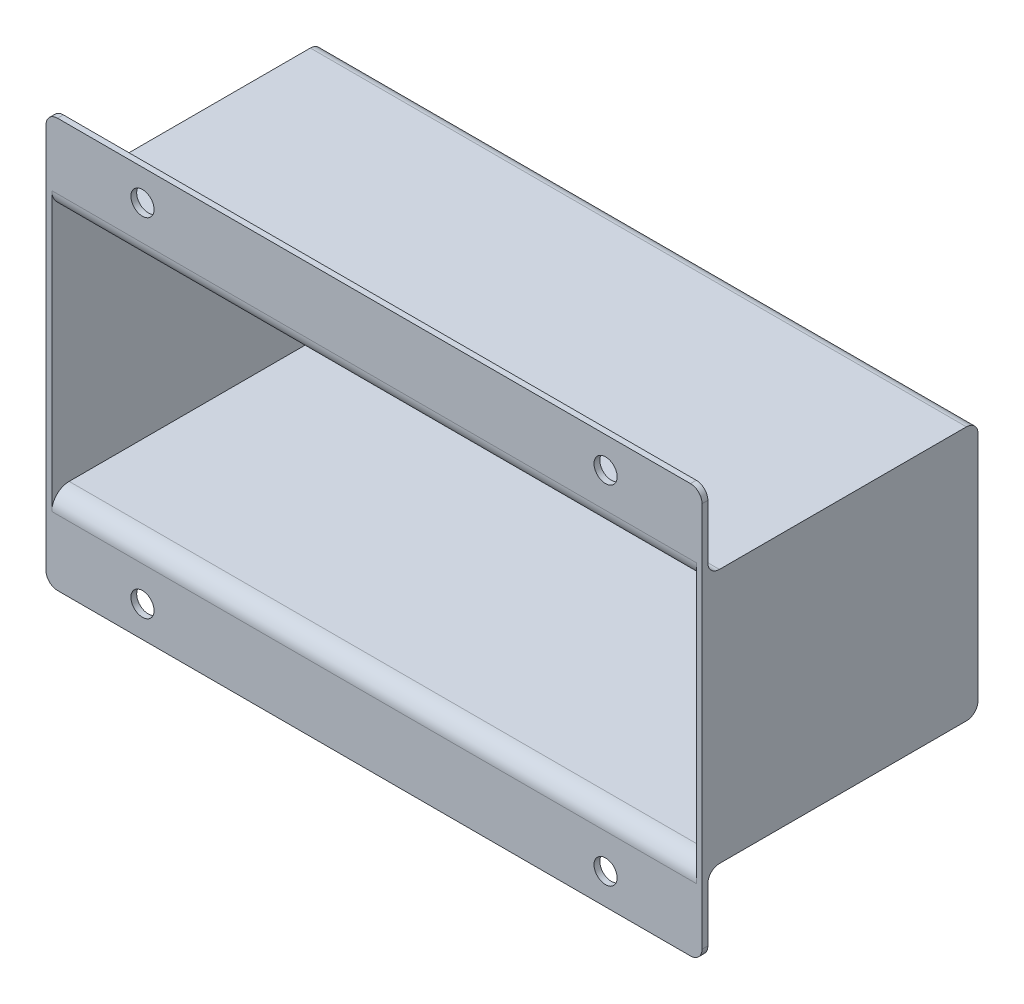
ISO-10303-21;
HEADER;
FILE_DESCRIPTION(('STEP AP214'),'2;1');
FILE_NAME('part.step','',(''),(''),'','','');
FILE_SCHEMA(('AUTOMOTIVE_DESIGN { 1 0 10303 214 1 1 1 1 }'));
ENDSEC;
DATA;
#1=APPLICATION_CONTEXT('core data for automotive mechanical design processes');
#2=APPLICATION_PROTOCOL_DEFINITION('international standard','automotive_design',2000,#1);
#3=PRODUCT_CONTEXT('',#1,'mechanical');
#4=PRODUCT('Part','Part','',(#3));
#5=PRODUCT_RELATED_PRODUCT_CATEGORY('part','',(#4));
#6=PRODUCT_DEFINITION_FORMATION('','',#4);
#7=PRODUCT_DEFINITION_CONTEXT('part definition',#1,'design');
#8=PRODUCT_DEFINITION('design','',#6,#7);
#9=PRODUCT_DEFINITION_SHAPE('','',#8);
#10=(LENGTH_UNIT() NAMED_UNIT(*) SI_UNIT(.MILLI.,.METRE.));
#11=(NAMED_UNIT(*) PLANE_ANGLE_UNIT() SI_UNIT($,.RADIAN.));
#12=(NAMED_UNIT(*) SI_UNIT($,.STERADIAN.) SOLID_ANGLE_UNIT());
#13=UNCERTAINTY_MEASURE_WITH_UNIT(LENGTH_MEASURE(1.E-05),#10,'distance_accuracy_value','');
#14=(GEOMETRIC_REPRESENTATION_CONTEXT(3) GLOBAL_UNCERTAINTY_ASSIGNED_CONTEXT((#13)) GLOBAL_UNIT_ASSIGNED_CONTEXT((#10,
#11,#12)) REPRESENTATION_CONTEXT('',''));
#15=CARTESIAN_POINT('',(0.,0.,0.));
#16=DIRECTION('',(0.,0.,1.));
#17=DIRECTION('',(1.,0.,0.));
#18=AXIS2_PLACEMENT_3D('',#15,#16,#17);
#19=CARTESIAN_POINT('',(0.,0.,70.));
#20=DIRECTION('',(1.,0.,0.));
#21=DIRECTION('',(0.,0.,-1.));
#22=AXIS2_PLACEMENT_3D('',#19,#20,#21);
#23=PLANE('',#22);
#24=DIRECTION('',(0.,-1.,0.));
#25=VECTOR('',#24,1.);
#26=CARTESIAN_POINT('',(0.,-20.,71.5));
#27=LINE('',#26,#25);
#28=CARTESIAN_POINT('',(0.,83.,71.5));
#29=VERTEX_POINT('',#28);
#30=CARTESIAN_POINT('',(0.,-17.,71.5));
#31=VERTEX_POINT('',#30);
#32=EDGE_CURVE('E342',#29,#31,#27,.T.);
#33=ORIENTED_EDGE('',*,*,#32,.F.);
#34=DIRECTION('',(0.,0.,-1.));
#35=VECTOR('',#34,1.);
#36=CARTESIAN_POINT('',(0.,83.,70.));
#37=LINE('',#36,#35);
#38=CARTESIAN_POINT('',(0.,83.,70.));
#39=VERTEX_POINT('',#38);
#40=EDGE_CURVE('E398',#29,#39,#37,.T.);
#41=ORIENTED_EDGE('',*,*,#40,.T.);
#42=DIRECTION('',(0.,-1.,0.));
#43=VECTOR('',#42,1.);
#44=CARTESIAN_POINT('',(0.,86.,70.));
#45=LINE('',#44,#43);
#46=CARTESIAN_POINT('',(0.,69.,70.));
#47=VERTEX_POINT('',#46);
#48=EDGE_CURVE('E250',#39,#47,#45,.T.);
#49=ORIENTED_EDGE('',*,*,#48,.T.);
#50=CARTESIAN_POINT('',(0.,69.,67.));
#51=DIRECTION('',(1.,0.,0.));
#52=DIRECTION('',(0.,0.,-1.));
#53=AXIS2_PLACEMENT_3D('',#50,#51,#52);
#54=CIRCLE('',#53,3.);
#55=CARTESIAN_POINT('',(0.,66.,67.));
#56=VERTEX_POINT('',#55);
#57=EDGE_CURVE('E328',#47,#56,#54,.T.);
#58=ORIENTED_EDGE('',*,*,#57,.T.);
#59=DIRECTION('',(0.,0.,-1.));
#60=VECTOR('',#59,1.);
#61=CARTESIAN_POINT('',(0.,66.,70.));
#62=LINE('',#61,#60);
#63=CARTESIAN_POINT('',(0.,66.,3.));
#64=VERTEX_POINT('',#63);
#65=EDGE_CURVE('E286',#56,#64,#62,.T.);
#66=ORIENTED_EDGE('',*,*,#65,.T.);
#67=CARTESIAN_POINT('',(0.,63.,3.));
#68=DIRECTION('',(1.,0.,0.));
#69=DIRECTION('',(0.,0.,-1.));
#70=AXIS2_PLACEMENT_3D('',#67,#68,#69);
#71=CIRCLE('',#70,3.);
#72=CARTESIAN_POINT('',(0.,63.,0.));
#73=VERTEX_POINT('',#72);
#74=EDGE_CURVE('E285',#64,#73,#71,.F.);
#75=ORIENTED_EDGE('',*,*,#74,.T.);
#76=DIRECTION('',(0.,-1.,0.));
#77=VECTOR('',#76,1.);
#78=CARTESIAN_POINT('',(0.,0.,0.));
#79=LINE('',#78,#77);
#80=CARTESIAN_POINT('',(0.,3.,0.));
#81=VERTEX_POINT('',#80);
#82=EDGE_CURVE('E365',#73,#81,#79,.T.);
#83=ORIENTED_EDGE('',*,*,#82,.T.);
#84=CARTESIAN_POINT('',(0.,3.,3.));
#85=DIRECTION('',(1.,0.,0.));
#86=DIRECTION('',(0.,0.,-1.));
#87=AXIS2_PLACEMENT_3D('',#84,#85,#86);
#88=CIRCLE('',#87,3.);
#89=CARTESIAN_POINT('',(0.,0.,3.));
#90=VERTEX_POINT('',#89);
#91=EDGE_CURVE('E324',#81,#90,#88,.F.);
#92=ORIENTED_EDGE('',*,*,#91,.T.);
#93=DIRECTION('',(0.,0.,-1.));
#94=VECTOR('',#93,1.);
#95=CARTESIAN_POINT('',(0.,0.,70.));
#96=LINE('',#95,#94);
#97=CARTESIAN_POINT('',(0.,0.,67.));
#98=VERTEX_POINT('',#97);
#99=EDGE_CURVE('E302',#98,#90,#96,.T.);
#100=ORIENTED_EDGE('',*,*,#99,.F.);
#101=CARTESIAN_POINT('',(0.,-3.,67.));
#102=DIRECTION('',(1.,0.,0.));
#103=DIRECTION('',(0.,0.,-1.));
#104=AXIS2_PLACEMENT_3D('',#101,#102,#103);
#105=CIRCLE('',#104,3.);
#106=CARTESIAN_POINT('',(0.,-3.,70.));
#107=VERTEX_POINT('',#106);
#108=EDGE_CURVE('E320',#98,#107,#105,.T.);
#109=ORIENTED_EDGE('',*,*,#108,.T.);
#110=CARTESIAN_POINT('',(0.,-17.,70.));
#111=VERTEX_POINT('',#110);
#112=EDGE_CURVE('E214',#107,#111,#45,.T.);
#113=ORIENTED_EDGE('',*,*,#112,.T.);
#114=DIRECTION('',(0.,0.,-1.));
#115=VECTOR('',#114,1.);
#116=CARTESIAN_POINT('',(0.,-17.,70.));
#117=LINE('',#116,#115);
#118=EDGE_CURVE('E393',#111,#31,#117,.F.);
#119=ORIENTED_EDGE('',*,*,#118,.T.);
#120=EDGE_LOOP('',(#33,#41,#49,#58,#66,#75,#83,#92,#100,#109,#113,#119));
#121=FACE_BOUND('',#120,.T.);
#122=ADVANCED_FACE('F33',(#121),#23,.F.);
#123=CARTESIAN_POINT('',(170.,0.,70.));
#124=DIRECTION('',(-1.,0.,0.));
#125=DIRECTION('',(0.,0.,1.));
#126=AXIS2_PLACEMENT_3D('',#123,#124,#125);
#127=PLANE('',#126);
#128=DIRECTION('',(0.,1.,0.));
#129=VECTOR('',#128,1.);
#130=CARTESIAN_POINT('',(170.,86.,70.));
#131=LINE('',#130,#129);
#132=CARTESIAN_POINT('',(170.,69.,70.));
#133=VERTEX_POINT('',#132);
#134=CARTESIAN_POINT('',(170.,83.,70.));
#135=VERTEX_POINT('',#134);
#136=EDGE_CURVE('E263',#133,#135,#131,.T.);
#137=ORIENTED_EDGE('',*,*,#136,.T.);
#138=DIRECTION('',(0.,0.,-1.));
#139=VECTOR('',#138,1.);
#140=CARTESIAN_POINT('',(170.,83.,70.));
#141=LINE('',#140,#139);
#142=CARTESIAN_POINT('',(170.,83.,71.5));
#143=VERTEX_POINT('',#142);
#144=EDGE_CURVE('E420',#135,#143,#141,.F.);
#145=ORIENTED_EDGE('',*,*,#144,.T.);
#146=DIRECTION('',(0.,1.,0.));
#147=VECTOR('',#146,1.);
#148=CARTESIAN_POINT('',(170.,0.,71.5));
#149=LINE('',#148,#147);
#150=CARTESIAN_POINT('',(170.,-17.,71.5));
#151=VERTEX_POINT('',#150);
#152=EDGE_CURVE('E204',#151,#143,#149,.T.);
#153=ORIENTED_EDGE('',*,*,#152,.F.);
#154=DIRECTION('',(0.,0.,-1.));
#155=VECTOR('',#154,1.);
#156=CARTESIAN_POINT('',(170.,-17.,70.));
#157=LINE('',#156,#155);
#158=CARTESIAN_POINT('',(170.,-17.,70.));
#159=VERTEX_POINT('',#158);
#160=EDGE_CURVE('E259',#151,#159,#157,.T.);
#161=ORIENTED_EDGE('',*,*,#160,.T.);
#162=CARTESIAN_POINT('',(170.,-3.,70.));
#163=VERTEX_POINT('',#162);
#164=EDGE_CURVE('E260',#159,#163,#131,.T.);
#165=ORIENTED_EDGE('',*,*,#164,.T.);
#166=CARTESIAN_POINT('',(170.,-3.,67.));
#167=DIRECTION('',(-1.,0.,0.));
#168=DIRECTION('',(0.,0.,1.));
#169=AXIS2_PLACEMENT_3D('',#166,#167,#168);
#170=CIRCLE('',#169,3.);
#171=CARTESIAN_POINT('',(170.,0.,67.));
#172=VERTEX_POINT('',#171);
#173=EDGE_CURVE('E329',#163,#172,#170,.T.);
#174=ORIENTED_EDGE('',*,*,#173,.T.);
#175=DIRECTION('',(0.,0.,-1.));
#176=VECTOR('',#175,1.);
#177=CARTESIAN_POINT('',(170.,0.,70.));
#178=LINE('',#177,#176);
#179=CARTESIAN_POINT('',(170.,0.,3.));
#180=VERTEX_POINT('',#179);
#181=EDGE_CURVE('E299',#172,#180,#178,.T.);
#182=ORIENTED_EDGE('',*,*,#181,.T.);
#183=CARTESIAN_POINT('',(170.,3.,3.));
#184=DIRECTION('',(-1.,0.,0.));
#185=DIRECTION('',(0.,0.,1.));
#186=AXIS2_PLACEMENT_3D('',#183,#184,#185);
#187=CIRCLE('',#186,3.);
#188=CARTESIAN_POINT('',(170.,3.,0.));
#189=VERTEX_POINT('',#188);
#190=EDGE_CURVE('E278',#180,#189,#187,.F.);
#191=ORIENTED_EDGE('',*,*,#190,.T.);
#192=DIRECTION('',(0.,1.,0.));
#193=VECTOR('',#192,1.);
#194=CARTESIAN_POINT('',(170.,0.,0.));
#195=LINE('',#194,#193);
#196=CARTESIAN_POINT('',(170.,63.,0.));
#197=VERTEX_POINT('',#196);
#198=EDGE_CURVE('E290',#189,#197,#195,.T.);
#199=ORIENTED_EDGE('',*,*,#198,.T.);
#200=CARTESIAN_POINT('',(170.,63.,3.));
#201=DIRECTION('',(-1.,0.,0.));
#202=DIRECTION('',(0.,0.,1.));
#203=AXIS2_PLACEMENT_3D('',#200,#201,#202);
#204=CIRCLE('',#203,3.);
#205=CARTESIAN_POINT('',(170.,66.,3.));
#206=VERTEX_POINT('',#205);
#207=EDGE_CURVE('E276',#197,#206,#204,.F.);
#208=ORIENTED_EDGE('',*,*,#207,.T.);
#209=DIRECTION('',(0.,0.,-1.));
#210=VECTOR('',#209,1.);
#211=CARTESIAN_POINT('',(170.,66.,70.));
#212=LINE('',#211,#210);
#213=CARTESIAN_POINT('',(170.,66.,67.));
#214=VERTEX_POINT('',#213);
#215=EDGE_CURVE('E273',#214,#206,#212,.T.);
#216=ORIENTED_EDGE('',*,*,#215,.F.);
#217=CARTESIAN_POINT('',(170.,69.,67.));
#218=DIRECTION('',(-1.,0.,0.));
#219=DIRECTION('',(0.,0.,1.));
#220=AXIS2_PLACEMENT_3D('',#217,#218,#219);
#221=CIRCLE('',#220,3.);
#222=EDGE_CURVE('E331',#214,#133,#221,.T.);
#223=ORIENTED_EDGE('',*,*,#222,.T.);
#224=EDGE_LOOP('',(#137,#145,#153,#161,#165,#174,#182,#191,#199,#208,#216,#223));
#225=FACE_BOUND('',#224,.T.);
#226=ADVANCED_FACE('F371',(#225),#127,.F.);
#227=CARTESIAN_POINT('',(0.,-20.,75.));
#228=DIRECTION('',(0.,1.,0.));
#229=DIRECTION('',(0.,0.,1.));
#230=AXIS2_PLACEMENT_3D('',#227,#228,#229);
#231=PLANE('',#230);
#232=DIRECTION('',(1.,0.,0.));
#233=VECTOR('',#232,1.);
#234=CARTESIAN_POINT('',(0.,-20.,71.5));
#235=LINE('',#234,#233);
#236=CARTESIAN_POINT('',(3.,-20.,71.5));
#237=VERTEX_POINT('',#236);
#238=CARTESIAN_POINT('',(167.,-20.,71.5));
#239=VERTEX_POINT('',#238);
#240=EDGE_CURVE('E234',#237,#239,#235,.T.);
#241=ORIENTED_EDGE('',*,*,#240,.F.);
#242=DIRECTION('',(0.,0.,-1.));
#243=VECTOR('',#242,1.);
#244=CARTESIAN_POINT('',(3.,-20.,75.));
#245=LINE('',#244,#243);
#246=CARTESIAN_POINT('',(3.,-20.,70.));
#247=VERTEX_POINT('',#246);
#248=EDGE_CURVE('E409',#237,#247,#245,.T.);
#249=ORIENTED_EDGE('',*,*,#248,.T.);
#250=DIRECTION('',(1.,0.,0.));
#251=VECTOR('',#250,1.);
#252=CARTESIAN_POINT('',(0.,-20.,70.));
#253=LINE('',#252,#251);
#254=CARTESIAN_POINT('',(167.,-20.,70.));
#255=VERTEX_POINT('',#254);
#256=EDGE_CURVE('E243',#247,#255,#253,.T.);
#257=ORIENTED_EDGE('',*,*,#256,.T.);
#258=DIRECTION('',(0.,0.,-1.));
#259=VECTOR('',#258,1.);
#260=CARTESIAN_POINT('',(167.,-20.,75.));
#261=LINE('',#260,#259);
#262=EDGE_CURVE('E402',#255,#239,#261,.F.);
#263=ORIENTED_EDGE('',*,*,#262,.T.);
#264=EDGE_LOOP('',(#241,#249,#257,#263));
#265=FACE_BOUND('',#264,.T.);
#266=ADVANCED_FACE('F412',(#265),#231,.F.);
#267=CARTESIAN_POINT('',(0.,86.,75.));
#268=DIRECTION('',(0.,-1.,0.));
#269=DIRECTION('',(0.,0.,-1.));
#270=AXIS2_PLACEMENT_3D('',#267,#268,#269);
#271=PLANE('',#270);
#272=DIRECTION('',(-1.,0.,0.));
#273=VECTOR('',#272,1.);
#274=CARTESIAN_POINT('',(0.,86.,71.5));
#275=LINE('',#274,#273);
#276=CARTESIAN_POINT('',(167.,86.,71.5));
#277=VERTEX_POINT('',#276);
#278=CARTESIAN_POINT('',(3.,86.,71.5));
#279=VERTEX_POINT('',#278);
#280=EDGE_CURVE('E237',#277,#279,#275,.T.);
#281=ORIENTED_EDGE('',*,*,#280,.F.);
#282=DIRECTION('',(0.,0.,-1.));
#283=VECTOR('',#282,1.);
#284=CARTESIAN_POINT('',(167.,86.,75.));
#285=LINE('',#284,#283);
#286=CARTESIAN_POINT('',(167.,86.,70.));
#287=VERTEX_POINT('',#286);
#288=EDGE_CURVE('E253',#277,#287,#285,.T.);
#289=ORIENTED_EDGE('',*,*,#288,.T.);
#290=DIRECTION('',(-1.,0.,0.));
#291=VECTOR('',#290,1.);
#292=CARTESIAN_POINT('',(0.,86.,70.));
#293=LINE('',#292,#291);
#294=CARTESIAN_POINT('',(3.,86.,70.));
#295=VERTEX_POINT('',#294);
#296=EDGE_CURVE('E262',#287,#295,#293,.T.);
#297=ORIENTED_EDGE('',*,*,#296,.T.);
#298=DIRECTION('',(0.,0.,-1.));
#299=VECTOR('',#298,1.);
#300=CARTESIAN_POINT('',(3.,86.,75.));
#301=LINE('',#300,#299);
#302=EDGE_CURVE('E338',#295,#279,#301,.F.);
#303=ORIENTED_EDGE('',*,*,#302,.T.);
#304=EDGE_LOOP('',(#281,#289,#297,#303));
#305=FACE_BOUND('',#304,.T.);
#306=ADVANCED_FACE('F358',(#305),#271,.F.);
#307=CARTESIAN_POINT('',(1.5,0.,70.));
#308=DIRECTION('',(1.,0.,0.));
#309=DIRECTION('',(0.,0.,-1.));
#310=AXIS2_PLACEMENT_3D('',#307,#308,#309);
#311=PLANE('',#310);
#312=CARTESIAN_POINT('',(1.5,69.,67.));
#313=DIRECTION('',(1.,0.,0.));
#314=DIRECTION('',(0.,0.,-1.));
#315=AXIS2_PLACEMENT_3D('',#312,#313,#314);
#316=CIRCLE('',#315,4.5);
#317=CARTESIAN_POINT('',(1.5,69.,71.5));
#318=VERTEX_POINT('',#317);
#319=CARTESIAN_POINT('',(1.5,64.5,67.));
#320=VERTEX_POINT('',#319);
#321=EDGE_CURVE('E215',#318,#320,#316,.T.);
#322=ORIENTED_EDGE('',*,*,#321,.F.);
#323=DIRECTION('',(0.,-1.,0.));
#324=VECTOR('',#323,1.);
#325=CARTESIAN_POINT('',(1.5,0.,71.5));
#326=LINE('',#325,#324);
#327=CARTESIAN_POINT('',(1.5,-3.,71.5));
#328=VERTEX_POINT('',#327);
#329=EDGE_CURVE('E205',#318,#328,#326,.T.);
#330=ORIENTED_EDGE('',*,*,#329,.T.);
#331=CARTESIAN_POINT('',(1.5,-3.,67.));
#332=DIRECTION('',(1.,0.,0.));
#333=DIRECTION('',(0.,0.,-1.));
#334=AXIS2_PLACEMENT_3D('',#331,#332,#333);
#335=CIRCLE('',#334,4.5);
#336=CARTESIAN_POINT('',(1.5,1.5,67.));
#337=VERTEX_POINT('',#336);
#338=EDGE_CURVE('E222',#337,#328,#335,.T.);
#339=ORIENTED_EDGE('',*,*,#338,.F.);
#340=DIRECTION('',(0.,0.,-1.));
#341=VECTOR('',#340,1.);
#342=CARTESIAN_POINT('',(1.5,1.5,70.));
#343=LINE('',#342,#341);
#344=CARTESIAN_POINT('',(1.5,1.5,3.));
#345=VERTEX_POINT('',#344);
#346=EDGE_CURVE('E233',#337,#345,#343,.T.);
#347=ORIENTED_EDGE('',*,*,#346,.T.);
#348=CARTESIAN_POINT('',(1.5,3.,3.));
#349=DIRECTION('',(1.,0.,0.));
#350=DIRECTION('',(0.,0.,-1.));
#351=AXIS2_PLACEMENT_3D('',#348,#349,#350);
#352=CIRCLE('',#351,1.5);
#353=CARTESIAN_POINT('',(1.5,3.,1.5));
#354=VERTEX_POINT('',#353);
#355=EDGE_CURVE('E581',#354,#345,#352,.F.);
#356=ORIENTED_EDGE('',*,*,#355,.F.);
#357=DIRECTION('',(0.,-1.,0.));
#358=VECTOR('',#357,1.);
#359=CARTESIAN_POINT('',(1.5,66.,1.5));
#360=LINE('',#359,#358);
#361=CARTESIAN_POINT('',(1.5,63.,1.5));
#362=VERTEX_POINT('',#361);
#363=EDGE_CURVE('E240',#362,#354,#360,.T.);
#364=ORIENTED_EDGE('',*,*,#363,.F.);
#365=CARTESIAN_POINT('',(1.5,63.,3.));
#366=DIRECTION('',(1.,0.,0.));
#367=DIRECTION('',(0.,0.,-1.));
#368=AXIS2_PLACEMENT_3D('',#365,#366,#367);
#369=CIRCLE('',#368,1.5);
#370=CARTESIAN_POINT('',(1.5,64.5,3.));
#371=VERTEX_POINT('',#370);
#372=EDGE_CURVE('E583',#371,#362,#369,.F.);
#373=ORIENTED_EDGE('',*,*,#372,.F.);
#374=DIRECTION('',(0.,0.,-1.));
#375=VECTOR('',#374,1.);
#376=CARTESIAN_POINT('',(1.5,64.5,70.));
#377=LINE('',#376,#375);
#378=EDGE_CURVE('E590',#320,#371,#377,.T.);
#379=ORIENTED_EDGE('',*,*,#378,.F.);
#380=EDGE_LOOP('',(#322,#330,#339,#347,#356,#364,#373,#379));
#381=FACE_BOUND('',#380,.T.);
#382=ADVANCED_FACE('F480',(#381),#311,.T.);
#383=CARTESIAN_POINT('',(168.5,0.,70.));
#384=DIRECTION('',(-1.,0.,0.));
#385=DIRECTION('',(0.,0.,1.));
#386=AXIS2_PLACEMENT_3D('',#383,#384,#385);
#387=PLANE('',#386);
#388=CARTESIAN_POINT('',(168.5,-3.,67.));
#389=DIRECTION('',(-1.,0.,0.));
#390=DIRECTION('',(0.,0.,1.));
#391=AXIS2_PLACEMENT_3D('',#388,#389,#390);
#392=CIRCLE('',#391,4.5);
#393=CARTESIAN_POINT('',(168.5,-3.,71.5));
#394=VERTEX_POINT('',#393);
#395=CARTESIAN_POINT('',(168.5,1.5,67.));
#396=VERTEX_POINT('',#395);
#397=EDGE_CURVE('E199',#394,#396,#392,.T.);
#398=ORIENTED_EDGE('',*,*,#397,.F.);
#399=DIRECTION('',(0.,1.,0.));
#400=VECTOR('',#399,1.);
#401=CARTESIAN_POINT('',(168.5,0.,71.5));
#402=LINE('',#401,#400);
#403=CARTESIAN_POINT('',(168.5,69.,71.5));
#404=VERTEX_POINT('',#403);
#405=EDGE_CURVE('E193',#394,#404,#402,.T.);
#406=ORIENTED_EDGE('',*,*,#405,.T.);
#407=CARTESIAN_POINT('',(168.5,69.,67.));
#408=DIRECTION('',(-1.,0.,0.));
#409=DIRECTION('',(0.,0.,1.));
#410=AXIS2_PLACEMENT_3D('',#407,#408,#409);
#411=CIRCLE('',#410,4.5);
#412=CARTESIAN_POINT('',(168.5,64.5,67.));
#413=VERTEX_POINT('',#412);
#414=EDGE_CURVE('E197',#413,#404,#411,.T.);
#415=ORIENTED_EDGE('',*,*,#414,.F.);
#416=DIRECTION('',(0.,0.,-1.));
#417=VECTOR('',#416,1.);
#418=CARTESIAN_POINT('',(168.5,64.5,70.));
#419=LINE('',#418,#417);
#420=CARTESIAN_POINT('',(168.5,64.5,3.));
#421=VERTEX_POINT('',#420);
#422=EDGE_CURVE('E593',#413,#421,#419,.T.);
#423=ORIENTED_EDGE('',*,*,#422,.T.);
#424=CARTESIAN_POINT('',(168.5,63.,3.));
#425=DIRECTION('',(-1.,0.,0.));
#426=DIRECTION('',(0.,0.,1.));
#427=AXIS2_PLACEMENT_3D('',#424,#425,#426);
#428=CIRCLE('',#427,1.5);
#429=CARTESIAN_POINT('',(168.5,63.,1.5));
#430=VERTEX_POINT('',#429);
#431=EDGE_CURVE('E599',#430,#421,#428,.F.);
#432=ORIENTED_EDGE('',*,*,#431,.F.);
#433=DIRECTION('',(0.,1.,0.));
#434=VECTOR('',#433,1.);
#435=CARTESIAN_POINT('',(168.5,66.,1.5));
#436=LINE('',#435,#434);
#437=CARTESIAN_POINT('',(168.5,3.,1.5));
#438=VERTEX_POINT('',#437);
#439=EDGE_CURVE('E580',#438,#430,#436,.T.);
#440=ORIENTED_EDGE('',*,*,#439,.F.);
#441=CARTESIAN_POINT('',(168.5,3.,3.));
#442=DIRECTION('',(-1.,0.,0.));
#443=DIRECTION('',(0.,0.,1.));
#444=AXIS2_PLACEMENT_3D('',#441,#442,#443);
#445=CIRCLE('',#444,1.5);
#446=CARTESIAN_POINT('',(168.5,1.5,3.));
#447=VERTEX_POINT('',#446);
#448=EDGE_CURVE('E602',#447,#438,#445,.F.);
#449=ORIENTED_EDGE('',*,*,#448,.F.);
#450=DIRECTION('',(0.,0.,-1.));
#451=VECTOR('',#450,1.);
#452=CARTESIAN_POINT('',(168.5,1.5,70.));
#453=LINE('',#452,#451);
#454=EDGE_CURVE('E586',#396,#447,#453,.T.);
#455=ORIENTED_EDGE('',*,*,#454,.F.);
#456=EDGE_LOOP('',(#398,#406,#415,#423,#432,#440,#449,#455));
#457=FACE_BOUND('',#456,.T.);
#458=ADVANCED_FACE('F195',(#457),#387,.T.);
#459=CARTESIAN_POINT('',(0.,0.,70.));
#460=DIRECTION('',(0.,1.,0.));
#461=DIRECTION('',(0.,0.,1.));
#462=AXIS2_PLACEMENT_3D('',#459,#460,#461);
#463=PLANE('',#462);
#464=ORIENTED_EDGE('',*,*,#181,.F.);
#465=DIRECTION('',(1.,0.,0.));
#466=VECTOR('',#465,1.);
#467=CARTESIAN_POINT('',(0.,0.,67.));
#468=LINE('',#467,#466);
#469=EDGE_CURVE('E279',#172,#98,#468,.F.);
#470=ORIENTED_EDGE('',*,*,#469,.T.);
#471=ORIENTED_EDGE('',*,*,#99,.T.);
#472=DIRECTION('',(1.,0.,0.));
#473=VECTOR('',#472,1.);
#474=CARTESIAN_POINT('',(170.,0.,3.));
#475=LINE('',#474,#473);
#476=EDGE_CURVE('E306',#90,#180,#475,.T.);
#477=ORIENTED_EDGE('',*,*,#476,.T.);
#478=EDGE_LOOP('',(#464,#470,#471,#477));
#479=FACE_BOUND('',#478,.T.);
#480=ADVANCED_FACE('F312',(#479),#463,.F.);
#481=CARTESIAN_POINT('',(0.,66.,70.));
#482=DIRECTION('',(0.,-1.,0.));
#483=DIRECTION('',(0.,0.,-1.));
#484=AXIS2_PLACEMENT_3D('',#481,#482,#483);
#485=PLANE('',#484);
#486=ORIENTED_EDGE('',*,*,#215,.T.);
#487=DIRECTION('',(-1.,0.,0.));
#488=VECTOR('',#487,1.);
#489=CARTESIAN_POINT('',(0.,66.,3.));
#490=LINE('',#489,#488);
#491=EDGE_CURVE('E381',#206,#64,#490,.T.);
#492=ORIENTED_EDGE('',*,*,#491,.T.);
#493=ORIENTED_EDGE('',*,*,#65,.F.);
#494=DIRECTION('',(-1.,0.,0.));
#495=VECTOR('',#494,1.);
#496=CARTESIAN_POINT('',(170.,66.,67.));
#497=LINE('',#496,#495);
#498=EDGE_CURVE('E384',#56,#214,#497,.F.);
#499=ORIENTED_EDGE('',*,*,#498,.T.);
#500=EDGE_LOOP('',(#486,#492,#493,#499));
#501=FACE_BOUND('',#500,.T.);
#502=ADVANCED_FACE('F466',(#501),#485,.F.);
#503=CARTESIAN_POINT('',(0.,66.,0.));
#504=DIRECTION('',(0.,0.,-1.));
#505=DIRECTION('',(-1.,0.,0.));
#506=AXIS2_PLACEMENT_3D('',#503,#504,#505);
#507=PLANE('',#506);
#508=CARTESIAN_POINT('',(35.,33.,0.));
#509=DIRECTION('',(0.,0.,-1.));
#510=DIRECTION('',(1.,0.,0.));
#511=AXIS2_PLACEMENT_3D('',#508,#509,#510);
#512=CIRCLE('',#511,11.);
#513=CARTESIAN_POINT('',(46.,33.,0.));
#514=VERTEX_POINT('',#513);
#515=EDGE_CURVE('E350',#514,#514,#512,.T.);
#516=ORIENTED_EDGE('',*,*,#515,.F.);
#517=EDGE_LOOP('',(#516));
#518=FACE_BOUND('',#517,.T.);
#519=CARTESIAN_POINT('',(85.,33.,0.));
#520=DIRECTION('',(0.,0.,-1.));
#521=DIRECTION('',(-1.,0.,0.));
#522=AXIS2_PLACEMENT_3D('',#519,#520,#521);
#523=CIRCLE('',#522,11.);
#524=CARTESIAN_POINT('',(74.,33.,0.));
#525=VERTEX_POINT('',#524);
#526=EDGE_CURVE('E347',#525,#525,#523,.T.);
#527=ORIENTED_EDGE('',*,*,#526,.F.);
#528=EDGE_LOOP('',(#527));
#529=FACE_BOUND('',#528,.T.);
#530=CARTESIAN_POINT('',(135.,33.,0.));
#531=DIRECTION('',(0.,0.,-1.));
#532=DIRECTION('',(-1.,0.,0.));
#533=AXIS2_PLACEMENT_3D('',#530,#531,#532);
#534=CIRCLE('',#533,11.);
#535=CARTESIAN_POINT('',(124.,33.,0.));
#536=VERTEX_POINT('',#535);
#537=EDGE_CURVE('E343',#536,#536,#534,.T.);
#538=ORIENTED_EDGE('',*,*,#537,.F.);
#539=EDGE_LOOP('',(#538));
#540=FACE_BOUND('',#539,.T.);
#541=ORIENTED_EDGE('',*,*,#198,.F.);
#542=DIRECTION('',(1.,0.,0.));
#543=VECTOR('',#542,1.);
#544=CARTESIAN_POINT('',(0.,3.,0.));
#545=LINE('',#544,#543);
#546=EDGE_CURVE('E283',#189,#81,#545,.F.);
#547=ORIENTED_EDGE('',*,*,#546,.T.);
#548=ORIENTED_EDGE('',*,*,#82,.F.);
#549=DIRECTION('',(-1.,0.,0.));
#550=VECTOR('',#549,1.);
#551=CARTESIAN_POINT('',(170.,63.,0.));
#552=LINE('',#551,#550);
#553=EDGE_CURVE('E281',#73,#197,#552,.F.);
#554=ORIENTED_EDGE('',*,*,#553,.T.);
#555=EDGE_LOOP('',(#541,#547,#548,#554));
#556=FACE_BOUND('',#555,.T.);
#557=ADVANCED_FACE('F388',(#518,#529,#540,#556),#507,.T.);
#558=CARTESIAN_POINT('',(0.,-20.,70.));
#559=DIRECTION('',(0.,0.,1.));
#560=DIRECTION('',(1.,0.,0.));
#561=AXIS2_PLACEMENT_3D('',#558,#559,#560);
#562=PLANE('',#561);
#563=CARTESIAN_POINT('',(25.,-12.,70.));
#564=DIRECTION('',(0.,0.,1.));
#565=DIRECTION('',(1.,0.,0.));
#566=AXIS2_PLACEMENT_3D('',#563,#564,#565);
#567=CIRCLE('',#566,3.);
#568=CARTESIAN_POINT('',(28.,-12.,70.));
#569=VERTEX_POINT('',#568);
#570=EDGE_CURVE('E561',#569,#569,#567,.T.);
#571=ORIENTED_EDGE('',*,*,#570,.T.);
#572=EDGE_LOOP('',(#571));
#573=FACE_BOUND('',#572,.T.);
#574=CARTESIAN_POINT('',(145.,-12.,70.));
#575=DIRECTION('',(0.,0.,1.));
#576=DIRECTION('',(1.,0.,0.));
#577=AXIS2_PLACEMENT_3D('',#574,#575,#576);
#578=CIRCLE('',#577,2.99999999999999);
#579=CARTESIAN_POINT('',(148.,-12.,70.));
#580=VERTEX_POINT('',#579);
#581=EDGE_CURVE('E567',#580,#580,#578,.T.);
#582=ORIENTED_EDGE('',*,*,#581,.T.);
#583=EDGE_LOOP('',(#582));
#584=FACE_BOUND('',#583,.T.);
#585=ORIENTED_EDGE('',*,*,#256,.F.);
#586=CARTESIAN_POINT('',(3.,-17.,70.));
#587=DIRECTION('',(0.,0.,1.));
#588=DIRECTION('',(1.,0.,0.));
#589=AXIS2_PLACEMENT_3D('',#586,#587,#588);
#590=CIRCLE('',#589,3.);
#591=EDGE_CURVE('E11',#247,#111,#590,.F.);
#592=ORIENTED_EDGE('',*,*,#591,.T.);
#593=ORIENTED_EDGE('',*,*,#112,.F.);
#594=DIRECTION('',(1.,0.,0.));
#595=VECTOR('',#594,1.);
#596=CARTESIAN_POINT('',(170.,-3.,70.));
#597=LINE('',#596,#595);
#598=EDGE_CURVE('E303',#107,#163,#597,.T.);
#599=ORIENTED_EDGE('',*,*,#598,.T.);
#600=ORIENTED_EDGE('',*,*,#164,.F.);
#601=CARTESIAN_POINT('',(167.,-17.,70.));
#602=DIRECTION('',(0.,0.,1.));
#603=DIRECTION('',(1.,0.,0.));
#604=AXIS2_PLACEMENT_3D('',#601,#602,#603);
#605=CIRCLE('',#604,3.);
#606=EDGE_CURVE('E41',#159,#255,#605,.F.);
#607=ORIENTED_EDGE('',*,*,#606,.T.);
#608=EDGE_LOOP('',(#585,#592,#593,#599,#600,#607));
#609=FACE_BOUND('',#608,.T.);
#610=ADVANCED_FACE('F392',(#573,#584,#609),#562,.F.);
#611=CARTESIAN_POINT('',(145.,78.,70.));
#612=DIRECTION('',(0.,0.,1.));
#613=DIRECTION('',(1.,0.,0.));
#614=AXIS2_PLACEMENT_3D('',#611,#612,#613);
#615=CIRCLE('',#614,2.99999999999999);
#616=CARTESIAN_POINT('',(148.,78.,70.));
#617=VERTEX_POINT('',#616);
#618=EDGE_CURVE('E547',#617,#617,#615,.T.);
#619=ORIENTED_EDGE('',*,*,#618,.T.);
#620=EDGE_LOOP('',(#619));
#621=FACE_BOUND('',#620,.T.);
#622=CARTESIAN_POINT('',(25.,78.,70.));
#623=DIRECTION('',(0.,0.,1.));
#624=DIRECTION('',(1.,0.,0.));
#625=AXIS2_PLACEMENT_3D('',#622,#623,#624);
#626=CIRCLE('',#625,3.);
#627=CARTESIAN_POINT('',(28.,78.,70.));
#628=VERTEX_POINT('',#627);
#629=EDGE_CURVE('E552',#628,#628,#626,.T.);
#630=ORIENTED_EDGE('',*,*,#629,.T.);
#631=EDGE_LOOP('',(#630));
#632=FACE_BOUND('',#631,.T.);
#633=ORIENTED_EDGE('',*,*,#296,.F.);
#634=CARTESIAN_POINT('',(167.,83.,70.));
#635=DIRECTION('',(0.,0.,1.));
#636=DIRECTION('',(1.,0.,0.));
#637=AXIS2_PLACEMENT_3D('',#634,#635,#636);
#638=CIRCLE('',#637,3.);
#639=EDGE_CURVE('E257',#287,#135,#638,.F.);
#640=ORIENTED_EDGE('',*,*,#639,.T.);
#641=ORIENTED_EDGE('',*,*,#136,.F.);
#642=DIRECTION('',(-1.,0.,0.));
#643=VECTOR('',#642,1.);
#644=CARTESIAN_POINT('',(0.,69.,70.));
#645=LINE('',#644,#643);
#646=EDGE_CURVE('E333',#133,#47,#645,.T.);
#647=ORIENTED_EDGE('',*,*,#646,.T.);
#648=ORIENTED_EDGE('',*,*,#48,.F.);
#649=CARTESIAN_POINT('',(3.,83.,70.));
#650=DIRECTION('',(0.,0.,1.));
#651=DIRECTION('',(1.,0.,0.));
#652=AXIS2_PLACEMENT_3D('',#649,#650,#651);
#653=CIRCLE('',#652,3.);
#654=EDGE_CURVE('E255',#39,#295,#653,.F.);
#655=ORIENTED_EDGE('',*,*,#654,.T.);
#656=EDGE_LOOP('',(#633,#640,#641,#647,#648,#655));
#657=FACE_BOUND('',#656,.T.);
#658=ADVANCED_FACE('F362',(#621,#632,#657),#562,.F.);
#659=CARTESIAN_POINT('',(0.,-3.,67.));
#660=DIRECTION('',(-1.,0.,0.));
#661=DIRECTION('',(0.,0.,1.));
#662=AXIS2_PLACEMENT_3D('',#659,#660,#661);
#663=CYLINDRICAL_SURFACE('',#662,3.);
#664=ORIENTED_EDGE('',*,*,#108,.F.);
#665=ORIENTED_EDGE('',*,*,#469,.F.);
#666=ORIENTED_EDGE('',*,*,#173,.F.);
#667=ORIENTED_EDGE('',*,*,#598,.F.);
#668=EDGE_LOOP('',(#664,#665,#666,#667));
#669=FACE_BOUND('',#668,.T.);
#670=ADVANCED_FACE('F326',(#669),#663,.F.);
#671=CARTESIAN_POINT('',(0.,3.,3.));
#672=DIRECTION('',(-1.,0.,0.));
#673=DIRECTION('',(0.,0.,1.));
#674=AXIS2_PLACEMENT_3D('',#671,#672,#673);
#675=CYLINDRICAL_SURFACE('',#674,3.);
#676=ORIENTED_EDGE('',*,*,#91,.F.);
#677=ORIENTED_EDGE('',*,*,#546,.F.);
#678=ORIENTED_EDGE('',*,*,#190,.F.);
#679=ORIENTED_EDGE('',*,*,#476,.F.);
#680=EDGE_LOOP('',(#676,#677,#678,#679));
#681=FACE_BOUND('',#680,.T.);
#682=ADVANCED_FACE('F390',(#681),#675,.T.);
#683=CARTESIAN_POINT('',(0.,63.,3.));
#684=DIRECTION('',(1.,0.,0.));
#685=DIRECTION('',(0.,0.,-1.));
#686=AXIS2_PLACEMENT_3D('',#683,#684,#685);
#687=CYLINDRICAL_SURFACE('',#686,3.);
#688=ORIENTED_EDGE('',*,*,#207,.F.);
#689=ORIENTED_EDGE('',*,*,#553,.F.);
#690=ORIENTED_EDGE('',*,*,#74,.F.);
#691=ORIENTED_EDGE('',*,*,#491,.F.);
#692=EDGE_LOOP('',(#688,#689,#690,#691));
#693=FACE_BOUND('',#692,.T.);
#694=ADVANCED_FACE('F379',(#693),#687,.T.);
#695=CARTESIAN_POINT('',(0.,69.,67.));
#696=DIRECTION('',(1.,0.,0.));
#697=DIRECTION('',(0.,0.,-1.));
#698=AXIS2_PLACEMENT_3D('',#695,#696,#697);
#699=CYLINDRICAL_SURFACE('',#698,3.);
#700=ORIENTED_EDGE('',*,*,#222,.F.);
#701=ORIENTED_EDGE('',*,*,#498,.F.);
#702=ORIENTED_EDGE('',*,*,#57,.F.);
#703=ORIENTED_EDGE('',*,*,#646,.F.);
#704=EDGE_LOOP('',(#700,#701,#702,#703));
#705=FACE_BOUND('',#704,.T.);
#706=ADVANCED_FACE('F451',(#705),#699,.F.);
#707=CARTESIAN_POINT('',(0.,1.5,70.));
#708=DIRECTION('',(0.,1.,0.));
#709=DIRECTION('',(0.,0.,1.));
#710=AXIS2_PLACEMENT_3D('',#707,#708,#709);
#711=PLANE('',#710);
#712=ORIENTED_EDGE('',*,*,#454,.T.);
#713=DIRECTION('',(1.,0.,0.));
#714=VECTOR('',#713,1.);
#715=CARTESIAN_POINT('',(0.,1.5,3.));
#716=LINE('',#715,#714);
#717=EDGE_CURVE('E232',#345,#447,#716,.T.);
#718=ORIENTED_EDGE('',*,*,#717,.F.);
#719=ORIENTED_EDGE('',*,*,#346,.F.);
#720=DIRECTION('',(1.,0.,0.));
#721=VECTOR('',#720,1.);
#722=CARTESIAN_POINT('',(0.,1.5,67.));
#723=LINE('',#722,#721);
#724=EDGE_CURVE('E597',#396,#337,#723,.F.);
#725=ORIENTED_EDGE('',*,*,#724,.F.);
#726=EDGE_LOOP('',(#712,#718,#719,#725));
#727=FACE_BOUND('',#726,.T.);
#728=ADVANCED_FACE('F453',(#727),#711,.T.);
#729=CARTESIAN_POINT('',(0.,64.5,70.));
#730=DIRECTION('',(0.,-1.,0.));
#731=DIRECTION('',(0.,0.,-1.));
#732=AXIS2_PLACEMENT_3D('',#729,#730,#731);
#733=PLANE('',#732);
#734=ORIENTED_EDGE('',*,*,#422,.F.);
#735=DIRECTION('',(1.,0.,0.));
#736=VECTOR('',#735,1.);
#737=CARTESIAN_POINT('',(0.,64.5,67.));
#738=LINE('',#737,#736);
#739=EDGE_CURVE('E212',#320,#413,#738,.T.);
#740=ORIENTED_EDGE('',*,*,#739,.F.);
#741=ORIENTED_EDGE('',*,*,#378,.T.);
#742=DIRECTION('',(1.,0.,0.));
#743=VECTOR('',#742,1.);
#744=CARTESIAN_POINT('',(0.,64.5,3.));
#745=LINE('',#744,#743);
#746=EDGE_CURVE('E220',#421,#371,#745,.F.);
#747=ORIENTED_EDGE('',*,*,#746,.F.);
#748=EDGE_LOOP('',(#734,#740,#741,#747));
#749=FACE_BOUND('',#748,.T.);
#750=ADVANCED_FACE('F458',(#749),#733,.T.);
#751=CARTESIAN_POINT('',(0.,66.,1.5));
#752=DIRECTION('',(0.,0.,-1.));
#753=DIRECTION('',(-1.,0.,0.));
#754=AXIS2_PLACEMENT_3D('',#751,#752,#753);
#755=PLANE('',#754);
#756=CARTESIAN_POINT('',(35.,33.,1.5));
#757=DIRECTION('',(0.,0.,-1.));
#758=DIRECTION('',(-1.,0.,0.));
#759=AXIS2_PLACEMENT_3D('',#756,#757,#758);
#760=CIRCLE('',#759,11.);
#761=CARTESIAN_POINT('',(24.,33.,1.5));
#762=VERTEX_POINT('',#761);
#763=EDGE_CURVE('E348',#762,#762,#760,.T.);
#764=ORIENTED_EDGE('',*,*,#763,.T.);
#765=EDGE_LOOP('',(#764));
#766=FACE_BOUND('',#765,.T.);
#767=CARTESIAN_POINT('',(85.,33.,1.5));
#768=DIRECTION('',(0.,0.,-1.));
#769=DIRECTION('',(-1.,0.,0.));
#770=AXIS2_PLACEMENT_3D('',#767,#768,#769);
#771=CIRCLE('',#770,11.);
#772=CARTESIAN_POINT('',(74.,33.,1.5));
#773=VERTEX_POINT('',#772);
#774=EDGE_CURVE('E344',#773,#773,#771,.T.);
#775=ORIENTED_EDGE('',*,*,#774,.T.);
#776=EDGE_LOOP('',(#775));
#777=FACE_BOUND('',#776,.T.);
#778=CARTESIAN_POINT('',(135.,33.,1.5));
#779=DIRECTION('',(0.,0.,-1.));
#780=DIRECTION('',(-1.,0.,0.));
#781=AXIS2_PLACEMENT_3D('',#778,#779,#780);
#782=CIRCLE('',#781,11.);
#783=CARTESIAN_POINT('',(124.,33.,1.5));
#784=VERTEX_POINT('',#783);
#785=EDGE_CURVE('E339',#784,#784,#782,.T.);
#786=ORIENTED_EDGE('',*,*,#785,.T.);
#787=EDGE_LOOP('',(#786));
#788=FACE_BOUND('',#787,.T.);
#789=ORIENTED_EDGE('',*,*,#439,.T.);
#790=DIRECTION('',(-1.,0.,0.));
#791=VECTOR('',#790,1.);
#792=CARTESIAN_POINT('',(0.,63.,1.5));
#793=LINE('',#792,#791);
#794=EDGE_CURVE('E604',#362,#430,#793,.F.);
#795=ORIENTED_EDGE('',*,*,#794,.F.);
#796=ORIENTED_EDGE('',*,*,#363,.T.);
#797=DIRECTION('',(-1.,0.,0.));
#798=VECTOR('',#797,1.);
#799=CARTESIAN_POINT('',(0.,3.,1.5));
#800=LINE('',#799,#798);
#801=EDGE_CURVE('E228',#438,#354,#800,.T.);
#802=ORIENTED_EDGE('',*,*,#801,.F.);
#803=EDGE_LOOP('',(#789,#795,#796,#802));
#804=FACE_BOUND('',#803,.T.);
#805=ADVANCED_FACE('F501',(#766,#777,#788,#804),#755,.F.);
#806=CARTESIAN_POINT('',(0.,-20.,71.5));
#807=DIRECTION('',(0.,0.,1.));
#808=DIRECTION('',(1.,0.,0.));
#809=AXIS2_PLACEMENT_3D('',#806,#807,#808);
#810=PLANE('',#809);
#811=CARTESIAN_POINT('',(145.,78.,71.5));
#812=DIRECTION('',(0.,0.,1.));
#813=DIRECTION('',(-1.,0.,0.));
#814=AXIS2_PLACEMENT_3D('',#811,#812,#813);
#815=CIRCLE('',#814,2.99999999999999);
#816=CARTESIAN_POINT('',(142.,78.,71.5));
#817=VERTEX_POINT('',#816);
#818=EDGE_CURVE('E544',#817,#817,#815,.T.);
#819=ORIENTED_EDGE('',*,*,#818,.F.);
#820=EDGE_LOOP('',(#819));
#821=FACE_BOUND('',#820,.T.);
#822=CARTESIAN_POINT('',(25.,78.,71.5));
#823=DIRECTION('',(0.,0.,1.));
#824=DIRECTION('',(1.,0.,0.));
#825=AXIS2_PLACEMENT_3D('',#822,#823,#824);
#826=CIRCLE('',#825,3.);
#827=CARTESIAN_POINT('',(28.,78.,71.5));
#828=VERTEX_POINT('',#827);
#829=EDGE_CURVE('E549',#828,#828,#826,.T.);
#830=ORIENTED_EDGE('',*,*,#829,.F.);
#831=EDGE_LOOP('',(#830));
#832=FACE_BOUND('',#831,.T.);
#833=CARTESIAN_POINT('',(25.,-12.,71.5));
#834=DIRECTION('',(0.,0.,1.));
#835=DIRECTION('',(-1.,0.,0.));
#836=AXIS2_PLACEMENT_3D('',#833,#834,#835);
#837=CIRCLE('',#836,3.);
#838=CARTESIAN_POINT('',(22.,-12.,71.5));
#839=VERTEX_POINT('',#838);
#840=EDGE_CURVE('E558',#839,#839,#837,.T.);
#841=ORIENTED_EDGE('',*,*,#840,.F.);
#842=EDGE_LOOP('',(#841));
#843=FACE_BOUND('',#842,.T.);
#844=CARTESIAN_POINT('',(145.,-12.,71.5));
#845=DIRECTION('',(0.,0.,1.));
#846=DIRECTION('',(1.,0.,0.));
#847=AXIS2_PLACEMENT_3D('',#844,#845,#846);
#848=CIRCLE('',#847,2.99999999999999);
#849=CARTESIAN_POINT('',(148.,-12.,71.5));
#850=VERTEX_POINT('',#849);
#851=EDGE_CURVE('E564',#850,#850,#848,.T.);
#852=ORIENTED_EDGE('',*,*,#851,.F.);
#853=EDGE_LOOP('',(#852));
#854=FACE_BOUND('',#853,.T.);
#855=ORIENTED_EDGE('',*,*,#329,.F.);
#856=DIRECTION('',(1.,0.,0.));
#857=VECTOR('',#856,1.);
#858=CARTESIAN_POINT('',(0.,69.,71.5));
#859=LINE('',#858,#857);
#860=EDGE_CURVE('E210',#404,#318,#859,.F.);
#861=ORIENTED_EDGE('',*,*,#860,.F.);
#862=ORIENTED_EDGE('',*,*,#405,.F.);
#863=DIRECTION('',(1.,0.,0.));
#864=VECTOR('',#863,1.);
#865=CARTESIAN_POINT('',(0.,-3.,71.5));
#866=LINE('',#865,#864);
#867=EDGE_CURVE('E230',#328,#394,#866,.T.);
#868=ORIENTED_EDGE('',*,*,#867,.F.);
#869=EDGE_LOOP('',(#855,#861,#862,#868));
#870=FACE_BOUND('',#869,.T.);
#871=ORIENTED_EDGE('',*,*,#152,.T.);
#872=CARTESIAN_POINT('',(167.,83.,71.5));
#873=DIRECTION('',(0.,0.,1.));
#874=DIRECTION('',(1.,0.,0.));
#875=AXIS2_PLACEMENT_3D('',#872,#873,#874);
#876=CIRCLE('',#875,3.);
#877=EDGE_CURVE('E399',#143,#277,#876,.T.);
#878=ORIENTED_EDGE('',*,*,#877,.T.);
#879=ORIENTED_EDGE('',*,*,#280,.T.);
#880=CARTESIAN_POINT('',(3.,83.,71.5));
#881=DIRECTION('',(0.,0.,1.));
#882=DIRECTION('',(1.,0.,0.));
#883=AXIS2_PLACEMENT_3D('',#880,#881,#882);
#884=CIRCLE('',#883,3.);
#885=EDGE_CURVE('E404',#279,#29,#884,.T.);
#886=ORIENTED_EDGE('',*,*,#885,.T.);
#887=ORIENTED_EDGE('',*,*,#32,.T.);
#888=CARTESIAN_POINT('',(3.,-17.,71.5));
#889=DIRECTION('',(0.,0.,1.));
#890=DIRECTION('',(1.,0.,0.));
#891=AXIS2_PLACEMENT_3D('',#888,#889,#890);
#892=CIRCLE('',#891,3.);
#893=EDGE_CURVE('E397',#31,#237,#892,.T.);
#894=ORIENTED_EDGE('',*,*,#893,.T.);
#895=ORIENTED_EDGE('',*,*,#240,.T.);
#896=CARTESIAN_POINT('',(167.,-17.,71.5));
#897=DIRECTION('',(0.,0.,1.));
#898=DIRECTION('',(1.,0.,0.));
#899=AXIS2_PLACEMENT_3D('',#896,#897,#898);
#900=CIRCLE('',#899,3.);
#901=EDGE_CURVE('E416',#239,#151,#900,.T.);
#902=ORIENTED_EDGE('',*,*,#901,.T.);
#903=EDGE_LOOP('',(#871,#878,#879,#886,#887,#894,#895,#902));
#904=FACE_BOUND('',#903,.T.);
#905=ADVANCED_FACE('F217',(#821,#832,#843,#854,#870,#904),#810,.T.);
#906=CARTESIAN_POINT('',(0.,-3.,67.));
#907=DIRECTION('',(-1.,0.,0.));
#908=DIRECTION('',(0.,0.,1.));
#909=AXIS2_PLACEMENT_3D('',#906,#907,#908);
#910=CYLINDRICAL_SURFACE('',#909,4.5);
#911=ORIENTED_EDGE('',*,*,#338,.T.);
#912=ORIENTED_EDGE('',*,*,#867,.T.);
#913=ORIENTED_EDGE('',*,*,#397,.T.);
#914=ORIENTED_EDGE('',*,*,#724,.T.);
#915=EDGE_LOOP('',(#911,#912,#913,#914));
#916=FACE_BOUND('',#915,.T.);
#917=ADVANCED_FACE('F494',(#916),#910,.T.);
#918=CARTESIAN_POINT('',(0.,3.,3.));
#919=DIRECTION('',(-1.,0.,0.));
#920=DIRECTION('',(0.,0.,1.));
#921=AXIS2_PLACEMENT_3D('',#918,#919,#920);
#922=CYLINDRICAL_SURFACE('',#921,1.5);
#923=ORIENTED_EDGE('',*,*,#355,.T.);
#924=ORIENTED_EDGE('',*,*,#717,.T.);
#925=ORIENTED_EDGE('',*,*,#448,.T.);
#926=ORIENTED_EDGE('',*,*,#801,.T.);
#927=EDGE_LOOP('',(#923,#924,#925,#926));
#928=FACE_BOUND('',#927,.T.);
#929=ADVANCED_FACE('F490',(#928),#922,.F.);
#930=CARTESIAN_POINT('',(0.,63.,3.));
#931=DIRECTION('',(1.,0.,0.));
#932=DIRECTION('',(0.,0.,-1.));
#933=AXIS2_PLACEMENT_3D('',#930,#931,#932);
#934=CYLINDRICAL_SURFACE('',#933,1.5);
#935=ORIENTED_EDGE('',*,*,#431,.T.);
#936=ORIENTED_EDGE('',*,*,#746,.T.);
#937=ORIENTED_EDGE('',*,*,#372,.T.);
#938=ORIENTED_EDGE('',*,*,#794,.T.);
#939=EDGE_LOOP('',(#935,#936,#937,#938));
#940=FACE_BOUND('',#939,.T.);
#941=ADVANCED_FACE('F487',(#940),#934,.F.);
#942=CARTESIAN_POINT('',(0.,69.,67.));
#943=DIRECTION('',(1.,0.,0.));
#944=DIRECTION('',(0.,0.,-1.));
#945=AXIS2_PLACEMENT_3D('',#942,#943,#944);
#946=CYLINDRICAL_SURFACE('',#945,4.5);
#947=ORIENTED_EDGE('',*,*,#414,.T.);
#948=ORIENTED_EDGE('',*,*,#860,.T.);
#949=ORIENTED_EDGE('',*,*,#321,.T.);
#950=ORIENTED_EDGE('',*,*,#739,.T.);
#951=EDGE_LOOP('',(#947,#948,#949,#950));
#952=FACE_BOUND('',#951,.T.);
#953=ADVANCED_FACE('F209',(#952),#946,.T.);
#954=CARTESIAN_POINT('',(135.,33.,5.));
#955=DIRECTION('',(0.,0.,-1.));
#956=DIRECTION('',(-1.,0.,0.));
#957=AXIS2_PLACEMENT_3D('',#954,#955,#956);
#958=CYLINDRICAL_SURFACE('',#957,11.);
#959=ORIENTED_EDGE('',*,*,#537,.T.);
#960=EDGE_LOOP('',(#959));
#961=FACE_BOUND('',#960,.T.);
#962=ORIENTED_EDGE('',*,*,#785,.F.);
#963=EDGE_LOOP('',(#962));
#964=FACE_BOUND('',#963,.T.);
#965=ADVANCED_FACE('F486',(#961,#964),#958,.F.);
#966=CARTESIAN_POINT('',(85.,33.,5.));
#967=DIRECTION('',(0.,0.,-1.));
#968=DIRECTION('',(-1.,0.,0.));
#969=AXIS2_PLACEMENT_3D('',#966,#967,#968);
#970=CYLINDRICAL_SURFACE('',#969,11.);
#971=ORIENTED_EDGE('',*,*,#526,.T.);
#972=EDGE_LOOP('',(#971));
#973=FACE_BOUND('',#972,.T.);
#974=ORIENTED_EDGE('',*,*,#774,.F.);
#975=EDGE_LOOP('',(#974));
#976=FACE_BOUND('',#975,.T.);
#977=ADVANCED_FACE('F516',(#973,#976),#970,.F.);
#978=CARTESIAN_POINT('',(35.,33.,5.));
#979=DIRECTION('',(0.,0.,-1.));
#980=DIRECTION('',(-1.,0.,0.));
#981=AXIS2_PLACEMENT_3D('',#978,#979,#980);
#982=CYLINDRICAL_SURFACE('',#981,11.);
#983=ORIENTED_EDGE('',*,*,#515,.T.);
#984=EDGE_LOOP('',(#983));
#985=FACE_BOUND('',#984,.T.);
#986=ORIENTED_EDGE('',*,*,#763,.F.);
#987=EDGE_LOOP('',(#986));
#988=FACE_BOUND('',#987,.T.);
#989=ADVANCED_FACE('F520',(#985,#988),#982,.F.);
#990=CARTESIAN_POINT('',(145.,-12.,66.5));
#991=DIRECTION('',(0.,0.,1.));
#992=DIRECTION('',(1.,0.,0.));
#993=AXIS2_PLACEMENT_3D('',#990,#991,#992);
#994=CYLINDRICAL_SURFACE('',#993,2.99999999999999);
#995=ORIENTED_EDGE('',*,*,#851,.T.);
#996=EDGE_LOOP('',(#995));
#997=FACE_BOUND('',#996,.T.);
#998=ORIENTED_EDGE('',*,*,#581,.F.);
#999=EDGE_LOOP('',(#998));
#1000=FACE_BOUND('',#999,.T.);
#1001=ADVANCED_FACE('F524',(#997,#1000),#994,.F.);
#1002=CARTESIAN_POINT('',(25.,-12.,66.5));
#1003=DIRECTION('',(0.,0.,1.));
#1004=DIRECTION('',(1.,0.,0.));
#1005=AXIS2_PLACEMENT_3D('',#1002,#1003,#1004);
#1006=CYLINDRICAL_SURFACE('',#1005,3.);
#1007=ORIENTED_EDGE('',*,*,#840,.T.);
#1008=EDGE_LOOP('',(#1007));
#1009=FACE_BOUND('',#1008,.T.);
#1010=ORIENTED_EDGE('',*,*,#570,.F.);
#1011=EDGE_LOOP('',(#1010));
#1012=FACE_BOUND('',#1011,.T.);
#1013=ADVANCED_FACE('F528',(#1009,#1012),#1006,.F.);
#1014=CARTESIAN_POINT('',(25.,78.,66.5));
#1015=DIRECTION('',(0.,0.,1.));
#1016=DIRECTION('',(1.,0.,0.));
#1017=AXIS2_PLACEMENT_3D('',#1014,#1015,#1016);
#1018=CYLINDRICAL_SURFACE('',#1017,3.);
#1019=ORIENTED_EDGE('',*,*,#829,.T.);
#1020=EDGE_LOOP('',(#1019));
#1021=FACE_BOUND('',#1020,.T.);
#1022=ORIENTED_EDGE('',*,*,#629,.F.);
#1023=EDGE_LOOP('',(#1022));
#1024=FACE_BOUND('',#1023,.T.);
#1025=ADVANCED_FACE('F532',(#1021,#1024),#1018,.F.);
#1026=CARTESIAN_POINT('',(145.,78.,66.5));
#1027=DIRECTION('',(0.,0.,1.));
#1028=DIRECTION('',(1.,0.,0.));
#1029=AXIS2_PLACEMENT_3D('',#1026,#1027,#1028);
#1030=CYLINDRICAL_SURFACE('',#1029,2.99999999999999);
#1031=ORIENTED_EDGE('',*,*,#818,.T.);
#1032=EDGE_LOOP('',(#1031));
#1033=FACE_BOUND('',#1032,.T.);
#1034=ORIENTED_EDGE('',*,*,#618,.F.);
#1035=EDGE_LOOP('',(#1034));
#1036=FACE_BOUND('',#1035,.T.);
#1037=ADVANCED_FACE('F435',(#1033,#1036),#1030,.F.);
#1038=CARTESIAN_POINT('',(167.,83.,75.));
#1039=DIRECTION('',(0.,0.,-1.));
#1040=DIRECTION('',(-1.,0.,0.));
#1041=AXIS2_PLACEMENT_3D('',#1038,#1039,#1040);
#1042=CYLINDRICAL_SURFACE('',#1041,3.);
#1043=ORIENTED_EDGE('',*,*,#877,.F.);
#1044=ORIENTED_EDGE('',*,*,#144,.F.);
#1045=ORIENTED_EDGE('',*,*,#639,.F.);
#1046=ORIENTED_EDGE('',*,*,#288,.F.);
#1047=EDGE_LOOP('',(#1043,#1044,#1045,#1046));
#1048=FACE_BOUND('',#1047,.T.);
#1049=ADVANCED_FACE('F429',(#1048),#1042,.T.);
#1050=CARTESIAN_POINT('',(3.,83.,70.));
#1051=DIRECTION('',(0.,0.,-1.));
#1052=DIRECTION('',(-1.,0.,0.));
#1053=AXIS2_PLACEMENT_3D('',#1050,#1051,#1052);
#1054=CYLINDRICAL_SURFACE('',#1053,3.);
#1055=ORIENTED_EDGE('',*,*,#885,.F.);
#1056=ORIENTED_EDGE('',*,*,#302,.F.);
#1057=ORIENTED_EDGE('',*,*,#654,.F.);
#1058=ORIENTED_EDGE('',*,*,#40,.F.);
#1059=EDGE_LOOP('',(#1055,#1056,#1057,#1058));
#1060=FACE_BOUND('',#1059,.T.);
#1061=ADVANCED_FACE('F427',(#1060),#1054,.T.);
#1062=CARTESIAN_POINT('',(3.,-17.,75.));
#1063=DIRECTION('',(0.,0.,-1.));
#1064=DIRECTION('',(-1.,0.,0.));
#1065=AXIS2_PLACEMENT_3D('',#1062,#1063,#1064);
#1066=CYLINDRICAL_SURFACE('',#1065,3.);
#1067=ORIENTED_EDGE('',*,*,#893,.F.);
#1068=ORIENTED_EDGE('',*,*,#118,.F.);
#1069=ORIENTED_EDGE('',*,*,#591,.F.);
#1070=ORIENTED_EDGE('',*,*,#248,.F.);
#1071=EDGE_LOOP('',(#1067,#1068,#1069,#1070));
#1072=FACE_BOUND('',#1071,.T.);
#1073=ADVANCED_FACE('F396',(#1072),#1066,.T.);
#1074=CARTESIAN_POINT('',(167.,-17.,70.));
#1075=DIRECTION('',(0.,0.,-1.));
#1076=DIRECTION('',(-1.,0.,0.));
#1077=AXIS2_PLACEMENT_3D('',#1074,#1075,#1076);
#1078=CYLINDRICAL_SURFACE('',#1077,3.);
#1079=ORIENTED_EDGE('',*,*,#901,.F.);
#1080=ORIENTED_EDGE('',*,*,#262,.F.);
#1081=ORIENTED_EDGE('',*,*,#606,.F.);
#1082=ORIENTED_EDGE('',*,*,#160,.F.);
#1083=EDGE_LOOP('',(#1079,#1080,#1081,#1082));
#1084=FACE_BOUND('',#1083,.T.);
#1085=ADVANCED_FACE('F35',(#1084),#1078,.T.);
#1086=CLOSED_SHELL('',(#122,#226,#266,#306,#382,#458,#480,#502,#557,#610,#658,#670,#682,#694,
#706,#728,#750,#805,#905,#917,#929,#941,#953,#965,#977,#989,#1001,#1013,#1025,#1037,#1049,#1061,
#1073,#1085));
#1087=MANIFOLD_SOLID_BREP('B2',#1086);
#1088=ADVANCED_BREP_SHAPE_REPRESENTATION('',(#18,#1087),#14);
#1089=SHAPE_DEFINITION_REPRESENTATION(#9,#1088);
ENDSEC;
END-ISO-10303-21;
